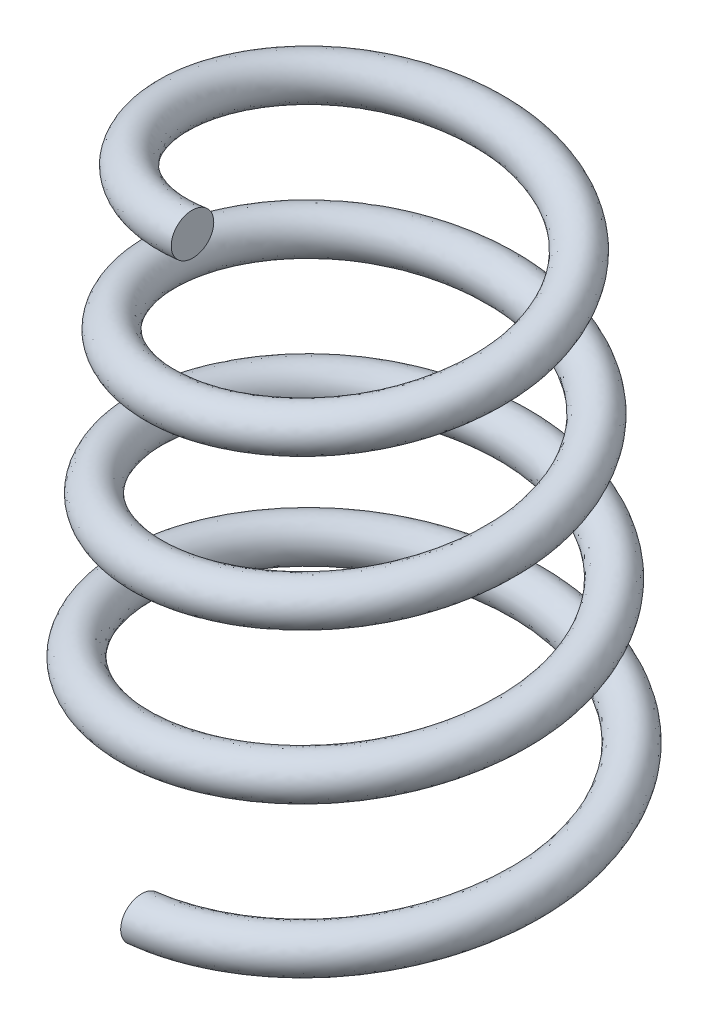
ISO-10303-21;
HEADER;
FILE_DESCRIPTION(('STEP AP214'),'2;1');
FILE_NAME('part.step','',(''),(''),'','','');
FILE_SCHEMA(('AUTOMOTIVE_DESIGN { 1 0 10303 214 1 1 1 1 }'));
ENDSEC;
DATA;
#1=APPLICATION_CONTEXT('core data for automotive mechanical design processes');
#2=APPLICATION_PROTOCOL_DEFINITION('international standard','automotive_design',2000,#1);
#3=PRODUCT_CONTEXT('',#1,'mechanical');
#4=PRODUCT('Part','Part','',(#3));
#5=PRODUCT_RELATED_PRODUCT_CATEGORY('part','',(#4));
#6=PRODUCT_DEFINITION_FORMATION('','',#4);
#7=PRODUCT_DEFINITION_CONTEXT('part definition',#1,'design');
#8=PRODUCT_DEFINITION('design','',#6,#7);
#9=PRODUCT_DEFINITION_SHAPE('','',#8);
#10=(LENGTH_UNIT() NAMED_UNIT(*) SI_UNIT(.MILLI.,.METRE.));
#11=(NAMED_UNIT(*) PLANE_ANGLE_UNIT() SI_UNIT($,.RADIAN.));
#12=(NAMED_UNIT(*) SI_UNIT($,.STERADIAN.) SOLID_ANGLE_UNIT());
#13=UNCERTAINTY_MEASURE_WITH_UNIT(LENGTH_MEASURE(1.E-05),#10,'distance_accuracy_value','');
#14=(GEOMETRIC_REPRESENTATION_CONTEXT(3) GLOBAL_UNCERTAINTY_ASSIGNED_CONTEXT((#13)) GLOBAL_UNIT_ASSIGNED_CONTEXT((#10,
#11,#12)) REPRESENTATION_CONTEXT('',''));
#15=CARTESIAN_POINT('',(0.,0.,0.));
#16=DIRECTION('',(0.,0.,1.));
#17=DIRECTION('',(1.,0.,0.));
#18=AXIS2_PLACEMENT_3D('',#15,#16,#17);
#19=CARTESIAN_POINT('',(-0.0596200976163737,-4.75659723193566,3.41562803727177));
#20=DIRECTION('',(0.999847694707909,0.,0.0174524321307998));
#21=DIRECTION('',(0.0174524321307998,0.,-0.999847694707909));
#22=AXIS2_PLACEMENT_3D('',#19,#20,#21);
#23=PLANE('',#22);
#24=CARTESIAN_POINT('',(-0.0596200976163737,-4.75659723193566,3.41562803727177));
#25=DIRECTION('',(0.999847694707909,0.,0.0174524321307998));
#26=DIRECTION('',(0.0174524321307998,0.,-0.999847694707909));
#27=AXIS2_PLACEMENT_3D('',#24,#25,#26);
#28=CIRCLE('',#27,0.35);
#29=CARTESIAN_POINT('',(-0.0535117463705938,-4.75659723193566,3.065681344124));
#30=VERTEX_POINT('',#29);
#31=EDGE_CURVE('E39',#30,#30,#28,.T.);
#32=ORIENTED_EDGE('',*,*,#31,.F.);
#33=EDGE_LOOP('',(#32));
#34=FACE_BOUND('',#33,.T.);
#35=ADVANCED_FACE('F32',(#34),#23,.F.);
#36=CARTESIAN_POINT('',(-0.0451146416645384,4.74340276806434,2.58461232116964));
#37=DIRECTION('',(0.99984769470791,0.,0.0174524321307422));
#38=DIRECTION('',(0.0174524321307422,0.,-0.99984769470791));
#39=AXIS2_PLACEMENT_3D('',#36,#37,#38);
#40=PLANE('',#39);
#41=CARTESIAN_POINT('',(-0.0451146416645384,4.74340276806434,2.58461232116964));
#42=DIRECTION('',(0.99984769470791,0.,0.0174524321307422));
#43=DIRECTION('',(0.0174524321307422,0.,-0.99984769470791));
#44=AXIS2_PLACEMENT_3D('',#41,#42,#43);
#45=CIRCLE('',#44,0.35);
#46=CARTESIAN_POINT('',(-0.0390062904187786,4.74340276806434,2.23466562802187));
#47=VERTEX_POINT('',#46);
#48=EDGE_CURVE('E11',#47,#47,#45,.T.);
#49=ORIENTED_EDGE('',*,*,#48,.T.);
#50=EDGE_LOOP('',(#49));
#51=FACE_BOUND('',#50,.T.);
#52=ADVANCED_FACE('F46',(#51),#40,.T.);
#53=CARTESIAN_POINT('',(-0.0535117463705938,-4.75659723193566,3.065681344124));
#54=CARTESIAN_POINT('',(0.750347781971695,-4.65750145627003,3.07104170741132));
#55=CARTESIAN_POINT('',(1.54755342235906,-4.55840568060533,2.74509411690741));
#56=CARTESIAN_POINT('',(2.6809311141912,-4.36021412927403,1.62408207934311));
#57=CARTESIAN_POINT('',(3.01037997350508,-4.26111835360862,0.836262511024693));
#58=CARTESIAN_POINT('',(3.01717666036292,-4.06292680227878,-0.744204597076181));
#59=CARTESIAN_POINT('',(2.69490544568697,-3.9638310266129,-1.52706006112067));
#60=CARTESIAN_POINT('',(1.5904341116593,-3.76563947528255,-2.6384317338444));
#61=CARTESIAN_POINT('',(0.815375814815229,-3.66654369961718,-2.96036167454748));
#62=CARTESIAN_POINT('',(-0.737830023036409,-3.46835214828631,-2.96335328356094));
#63=CARTESIAN_POINT('',(-1.50635520220292,-3.36925637262081,-2.64481948217569));
#64=CARTESIAN_POINT('',(-2.59579851587417,-3.17106482129073,-1.55697944500539));
#65=CARTESIAN_POINT('',(-2.91026681524683,-3.07196904562511,-0.794711413227318));
#66=CARTESIAN_POINT('',(-2.90957233023542,-2.87377749429446,0.731224203878779));
#67=CARTESIAN_POINT('',(-2.59483691006074,-2.77468171862911,1.4854391966849));
#68=CARTESIAN_POINT('',(-1.52371850271708,-2.57649016729851,2.55303210173393));
#69=CARTESIAN_POINT('',(-0.774269540363933,-2.47739439163281,2.86009612760226));
#70=CARTESIAN_POINT('',(0.724387294908949,-2.27920284030285,2.85583455309092));
#71=CARTESIAN_POINT('',(1.46431239764876,-2.18010706463694,2.54495841195092));
#72=CARTESIAN_POINT('',(2.51013313405899,-1.98191551330676,1.49065170628493));
#73=CARTESIAN_POINT('',(2.80985034428995,-1.88281973764137,0.754050428199204));
#74=CARTESIAN_POINT('',(2.80214070433403,-1.68462818631038,-0.717319453623387));
#75=CARTESIAN_POINT('',(2.49518466946423,-1.58553241064529,-1.44297516012349));
#76=CARTESIAN_POINT('',(1.45777947525812,-1.3873408593145,-2.46710225671483));
#77=CARTESIAN_POINT('',(0.73405430656252,-1.2882450836491,-2.75953019864338));
#78=CARTESIAN_POINT('',(-0.71002083969374,-1.09005353231873,-2.74849153568115));
#79=CARTESIAN_POINT('',(-1.4214278411404,-0.990957756653374,-2.44551636311084));
#80=CARTESIAN_POINT('',(-2.42394011473337,-0.792766205322497,-1.42510222735286));
#81=CARTESIAN_POINT('',(-2.70913642464514,-0.693670429657447,-0.714281403138023));
#82=CARTESIAN_POINT('',(-2.69488779835506,-0.495478878326467,0.702491614966737));
#83=CARTESIAN_POINT('',(-2.39595417234135,-0.3963831026612,1.39967079963997));
#84=CARTESIAN_POINT('',(-1.39262037839568,-0.198191551330758,2.38064735439829));
#85=CARTESIAN_POINT('',(-0.694731943475053,-0.0990957756657933,2.6586697568723));
#86=CARTESIAN_POINT('',(0.692804806262994,0.0988208910018053,2.64135429241929));
#87=CARTESIAN_POINT('',(1.37395325822134,0.197641782002138,2.348198404388));
#88=CARTESIAN_POINT('',(2.33298178089921,0.395283564005911,1.36683275894877));
#89=CARTESIAN_POINT('',(2.60528337843775,0.494104455006602,0.684928502865882));
#90=CARTESIAN_POINT('',(2.59095576318339,0.69174623700948,-0.67359203313435));
#91=CARTESIAN_POINT('',(2.30483165130455,0.790567128010226,-1.34188757303408));
#92=CARTESIAN_POINT('',(1.34467701033049,0.988208910013908,-2.28381290267626));
#93=CARTESIAN_POINT('',(0.67682272482872,1.08702980101448,-2.55196831717426));
#94=CARTESIAN_POINT('',(-0.65460252674914,1.28467158301769,-2.54048622135447));
#95=CARTESIAN_POINT('',(-1.31001777889513,1.38349247401838,-2.26133638244993));
#96=CARTESIAN_POINT('',(-2.23475202122431,1.58113425602184,-1.32231335719128));
#97=CARTESIAN_POINT('',(-2.49870127095248,1.67995514702336,-0.668487641448264));
#98=CARTESIAN_POINT('',(-2.48994640135878,1.8775969290249,0.635836504975012));
#99=CARTESIAN_POINT('',(-2.21771324644204,1.97641782002636,1.27834428347292));
#100=CARTESIAN_POINT('',(-1.2997421657686,2.17405960202994,2.18579980937242));
#101=CARTESIAN_POINT('',(-0.659923424181321,2.27288049303109,2.44548298639224));
#102=CARTESIAN_POINT('',(0.617294183529817,2.47052227503324,2.43933703826143));
#103=CARTESIAN_POINT('',(1.24686749251559,2.56934316603444,2.17396289303993));
#104=CARTESIAN_POINT('',(2.13695693888654,2.76698494803795,1.27696380427028));
#105=CARTESIAN_POINT('',(2.39231420960297,2.86580583903866,0.651130246664219));
#106=CARTESIAN_POINT('',(2.38865886772282,3.06344762104176,-0.598975776001237));
#107=CARTESIAN_POINT('',(2.13008597318445,3.16226851204439,-1.21558780987042));
#108=CARTESIAN_POINT('',(1.25397864282596,3.35991029404409,-2.08822408044168));
#109=CARTESIAN_POINT('',(0.642108284685686,3.45873118504759,-2.33919568616781));
#110=CARTESIAN_POINT('',(-0.580881493818942,3.65637296704892,-2.33791262600266));
#111=CARTESIAN_POINT('',(-1.1845056374974,3.75519385805084,-2.08608313896377));
#112=CARTESIAN_POINT('',(-2.0396019035999,3.95283564005372,-1.23078705351312));
#113=CARTESIAN_POINT('',(-2.28612816113168,4.05165653105386,-0.632857716202063));
#114=CARTESIAN_POINT('',(-2.2870990499602,4.24929831305873,0.563011546270275));
#115=CARTESIAN_POINT('',(-2.0419550436029,4.3481192040594,1.15362137542511));
#116=CARTESIAN_POINT('',(-1.20738941035937,4.54576098606125,1.99109107684599));
#117=CARTESIAN_POINT('',(-0.623378728914578,4.64458187706277,2.23311237920852));
#118=CARTESIAN_POINT('',(-0.0390062904187786,4.74340276806434,2.23466562802187));
#119=CARTESIAN_POINT('',(-0.0535117463705938,-4.05659723193566,3.065681344124));
#120=CARTESIAN_POINT('',(0.750347781971695,-3.95750145627003,3.07104170741132));
#121=CARTESIAN_POINT('',(1.54755342235906,-3.85840568060533,2.74509411690741));
#122=CARTESIAN_POINT('',(2.6809311141912,-3.66021412927403,1.62408207934311));
#123=CARTESIAN_POINT('',(3.01037997350508,-3.56111835360862,0.836262511024693));
#124=CARTESIAN_POINT('',(3.01717666036292,-3.36292680227879,-0.744204597076181));
#125=CARTESIAN_POINT('',(2.69490544568697,-3.26383102661271,-1.52706006112067));
#126=CARTESIAN_POINT('',(1.5904341116593,-3.06563947528274,-2.6384317338444));
#127=CARTESIAN_POINT('',(0.815375814815229,-2.96654369961719,-2.96036167454748));
#128=CARTESIAN_POINT('',(-0.737830023036409,-2.76835214828631,-2.96335328356094));
#129=CARTESIAN_POINT('',(-1.50635520220292,-2.66925637262081,-2.64481948217569));
#130=CARTESIAN_POINT('',(-2.59579851587417,-2.47106482129073,-1.5569794450054));
#131=CARTESIAN_POINT('',(-2.91026681524683,-2.37196904562511,-0.794711413227318));
#132=CARTESIAN_POINT('',(-2.90957233023542,-2.17377749429446,0.731224203878779));
#133=CARTESIAN_POINT('',(-2.59483691006074,-2.07468171862929,1.4854391966849));
#134=CARTESIAN_POINT('',(-1.52371850271709,-1.87649016729832,2.55303210173393));
#135=CARTESIAN_POINT('',(-0.774269540363933,-1.77739439163281,2.86009612760226));
#136=CARTESIAN_POINT('',(0.724387294908949,-1.57920284030285,2.85583455309092));
#137=CARTESIAN_POINT('',(1.46431239764876,-1.48010706463694,2.54495841195092));
#138=CARTESIAN_POINT('',(2.51013313405899,-1.28191551330676,1.49065170628493));
#139=CARTESIAN_POINT('',(2.80985034428995,-1.18281973764118,0.754050428199204));
#140=CARTESIAN_POINT('',(2.80214070433403,-0.984628186310562,-0.717319453623387));
#141=CARTESIAN_POINT('',(2.49518466946423,-0.885532410645291,-1.44297516012349));
#142=CARTESIAN_POINT('',(1.45777947525812,-0.687340859314497,-2.46710225671483));
#143=CARTESIAN_POINT('',(0.73405430656252,-0.588245083649101,-2.75953019864338));
#144=CARTESIAN_POINT('',(-0.71002083969374,-0.390053532318725,-2.74849153568115));
#145=CARTESIAN_POINT('',(-1.4214278411404,-0.290957756653283,-2.44551636311084));
#146=CARTESIAN_POINT('',(-2.42394011473337,-0.0927662053225897,-1.42510222735286));
#147=CARTESIAN_POINT('',(-2.70913642464514,0.00632957034255236,-0.714281403138023));
#148=CARTESIAN_POINT('',(-2.69488779835506,0.204521121673533,0.702491614966737));
#149=CARTESIAN_POINT('',(-2.39595417234135,0.3036168973388,1.39967079963997));
#150=CARTESIAN_POINT('',(-1.39262037839568,0.501808448669242,2.38064735439829));
#151=CARTESIAN_POINT('',(-0.694731943475053,0.600904224334206,2.6586697568723));
#152=CARTESIAN_POINT('',(0.692804806262994,0.798820891001805,2.64135429241929));
#153=CARTESIAN_POINT('',(1.37395325822134,0.897641782002138,2.348198404388));
#154=CARTESIAN_POINT('',(2.33298178089921,1.09528356400591,1.36683275894877));
#155=CARTESIAN_POINT('',(2.60528337843775,1.1941044550066,0.684928502865882));
#156=CARTESIAN_POINT('',(2.59095576318339,1.39174623700948,-0.67359203313435));
#157=CARTESIAN_POINT('',(2.30483165130455,1.49056712801014,-1.34188757303408));
#158=CARTESIAN_POINT('',(1.34467701033049,1.688208910014,-2.28381290267626));
#159=CARTESIAN_POINT('',(0.67682272482872,1.78702980101448,-2.55196831717426));
#160=CARTESIAN_POINT('',(-0.654602526749141,1.98467158301769,-2.54048622135447));
#161=CARTESIAN_POINT('',(-1.31001777889513,2.08349247401838,-2.26133638244993));
#162=CARTESIAN_POINT('',(-2.23475202122431,2.28113425602184,-1.32231335719128));
#163=CARTESIAN_POINT('',(-2.49870127095248,2.37995514702344,-0.668487641448264));
#164=CARTESIAN_POINT('',(-2.48994640135878,2.57759692902481,0.635836504975013));
#165=CARTESIAN_POINT('',(-2.21771324644204,2.67641782002636,1.27834428347292));
#166=CARTESIAN_POINT('',(-1.2997421657686,2.87405960202994,2.18579980937242));
#167=CARTESIAN_POINT('',(-0.659923424181321,2.97288049303109,2.44548298639224));
#168=CARTESIAN_POINT('',(0.617294183529817,3.17052227503324,2.43933703826143));
#169=CARTESIAN_POINT('',(1.24686749251559,3.26934316603444,2.17396289303993));
#170=CARTESIAN_POINT('',(2.13695693888654,3.46698494803795,1.27696380427028));
#171=CARTESIAN_POINT('',(2.39231420960297,3.56580583903866,0.651130246664219));
#172=CARTESIAN_POINT('',(2.38865886772282,3.76344762104176,-0.598975776001237));
#173=CARTESIAN_POINT('',(2.13008597318445,3.86226851204439,-1.21558780987042));
#174=CARTESIAN_POINT('',(1.25397864282596,4.05991029404409,-2.08822408044168));
#175=CARTESIAN_POINT('',(0.642108284685686,4.15873118504794,-2.33919568616781));
#176=CARTESIAN_POINT('',(-0.580881493818942,4.35637296704857,-2.33791262600266));
#177=CARTESIAN_POINT('',(-1.1845056374974,4.45519385805084,-2.08608313896377));
#178=CARTESIAN_POINT('',(-2.0396019035999,4.65283564005372,-1.23078705351312));
#179=CARTESIAN_POINT('',(-2.28612816113168,4.75165653105369,-0.632857716202063));
#180=CARTESIAN_POINT('',(-2.2870990499602,4.9492983130589,0.563011546270275));
#181=CARTESIAN_POINT('',(-2.0419550436029,5.0481192040594,1.15362137542511));
#182=CARTESIAN_POINT('',(-1.20738941035937,5.24576098606125,1.99109107684599));
#183=CARTESIAN_POINT('',(-0.623378728914578,5.34458187706277,2.23311237920852));
#184=CARTESIAN_POINT('',(-0.0390062904187786,5.44340276806434,2.23466562802187));
#185=CARTESIAN_POINT('',(-0.0657284488621536,-4.05659723193566,3.76557473041953));
#186=CARTESIAN_POINT('',(0.921617229713494,-3.95750145627003,3.77413786109047));
#187=CARTESIAN_POINT('',(1.90249339401658,-3.85840568060533,3.37572478600163));
#188=CARTESIAN_POINT('',(3.2996108073109,-3.66021412927403,1.99946569859627));
#189=CARTESIAN_POINT('',(3.70749589212703,-3.56111835360862,1.03044495174826));
#190=CARTESIAN_POINT('',(3.71989748853473,-3.36292680227879,-0.917007554038717));
#191=CARTESIAN_POINT('',(3.32476025456344,-3.26383102661271,-1.88337501171302));
#192=CARTESIAN_POINT('',(1.96446708694357,-3.06563947528274,-3.25792891517748));
#193=CARTESIAN_POINT('',(1.00803692137169,-2.96654369961719,-3.65789957480761));
#194=CARTESIAN_POINT('',(-0.912165668812998,-2.76835214828631,-3.66569544155124));
#195=CARTESIAN_POINT('',(-1.86404343579266,-2.66925637262081,-3.27389543293907));
#196=CARTESIAN_POINT('',(-3.21611023682474,-2.47106482129073,-1.92965999605229));
#197=CARTESIAN_POINT('',(-3.60822337710194,-2.37196904562511,-0.985850268615983));
#198=CARTESIAN_POINT('',(-3.61153247513525,-2.17377749429446,0.907091708691676));
#199=CARTESIAN_POINT('',(-3.22313100852519,-2.07468171862929,1.84449901079594));
#200=CARTESIAN_POINT('',(-1.89504485569276,-1.87649016729832,3.17415540983151));
#201=CARTESIAN_POINT('',(-0.963885234828928,-1.77739439163281,3.55846802901743));
#202=CARTESIAN_POINT('',(0.901785821688705,-1.57920284030285,3.5574093438086));
#203=CARTESIAN_POINT('',(1.8247420832823,-1.48010706463694,3.17246766764963));
#204=CARTESIAN_POINT('',(3.13206507296465,-1.28191551330676,1.86062209380342));
#205=CARTESIAN_POINT('',(3.50863426125297,-1.18281973764118,0.942142059235517));
#206=CARTESIAN_POINT('',(3.50332680161249,-0.984628186310562,-0.896248158014549));
#207=CARTESIAN_POINT('',(3.12190609566791,-0.885532410645291,-1.80477300175307));
#208=CARTESIAN_POINT('',(1.82639213638543,-0.687340859314497,-3.08983986624836));
#209=CARTESIAN_POINT('',(0.920620978918682,-0.588245083649101,-3.45872280518031));
#210=CARTESIAN_POINT('',(-0.890478870057249,-0.390053532318725,-3.44928560211401));
#211=CARTESIAN_POINT('',(-1.78459211673356,-0.290957756653283,-3.07144697683841));
#212=CARTESIAN_POINT('',(-3.04748043087393,-0.0927662053225898,-1.79235540761892));
#213=CARTESIAN_POINT('',(-3.40873439283758,0.00632957034255237,-0.899322228818943));
#214=CARTESIAN_POINT('',(-3.3952864984011,0.204521121673533,0.88447811238255));
#215=CARTESIAN_POINT('',(-3.02109099437652,0.3036168973388,1.76419978065789));
#216=CARTESIAN_POINT('',(-1.7585123298003,0.501808448669242,3.00498740930698));
#217=CARTESIAN_POINT('',(-0.878246041747875,0.600904224334206,3.3586697568723));
#218=CARTESIAN_POINT('',(0.875809849423206,0.798820891001805,3.34135429241929));
#219=CARTESIAN_POINT('',(1.7388425880029,0.897641782002138,2.97297566296321));
#220=CARTESIAN_POINT('',(2.95696148704428,1.09528356400591,1.73308427381333));
#221=CARTESIAN_POINT('',(3.304882457217,1.1941044550066,0.869460274631833));
#222=CARTESIAN_POINT('',(3.29135335264261,1.39174623700948,-0.855069476635195));
#223=CARTESIAN_POINT('',(2.93040348857853,1.49056712801014,-1.70541298098893));
#224=CARTESIAN_POINT('',(1.71228896705013,1.688208910014,-2.90699208645513));
#225=CARTESIAN_POINT('',(0.862880346891881,1.78702980101448,-3.25116314487952));
#226=CARTESIAN_POINT('',(-0.834551506819655,1.98467158301769,-3.241278066619));
#227=CARTESIAN_POINT('',(-1.67217753476482,2.08349247401838,-2.88769982091435));
#228=CARTESIAN_POINT('',(-2.85712771651777,2.28113425602184,-1.69128400605783));
#229=CARTESIAN_POINT('',(-3.19748851965466,2.37995514702344,-0.856070228238078));
#230=CARTESIAN_POINT('',(-3.19112916689808,2.57759692902481,0.8142561651197));
#231=CARTESIAN_POINT('',(-2.84486530481981,2.67641782002636,1.639136663501));
#232=CARTESIAN_POINT('',(-1.67006975060799,2.87405960202994,2.80736905388357));
#233=CARTESIAN_POINT('',(-0.849030082867357,2.97288049303109,3.14385933010184));
#234=CARTESIAN_POINT('',(0.794183674530638,3.17052227503324,3.1409073866847));
#235=CARTESIAN_POINT('',(1.6062907794547,3.26934316603444,2.801900586301));
#236=CARTESIAN_POINT('',(2.75771677415609,3.46698494803795,1.64864656244931));
#237=CARTESIAN_POINT('',(3.09027632428703,3.56580583903866,0.841760077164186));
#238=CARTESIAN_POINT('',(3.09061345979369,3.76344762104176,-0.774334255925483));
#239=CARTESIAN_POINT('',(2.75880631255953,3.86226851204439,-1.57364029298643));
#240=CARTESIAN_POINT('',(1.6270148052611,4.05991029404409,-2.70817155186603));
#241=CARTESIAN_POINT('',(0.834260379666298,4.15873118504794,-3.03674024976495));
#242=CARTESIAN_POINT('',(-0.754708128019734,4.35637296704857,-3.04024812065594));
#243=CARTESIAN_POINT('',(-1.54118561258271,4.45519385805084,-2.71558313195868));
#244=CARTESIAN_POINT('',(-2.65873406044006,4.65283564005372,-1.60517484467889));
#245=CARTESIAN_POINT('',(-2.98325185356627,4.75165653105369,-0.826531161084619));
#246=CARTESIAN_POINT('',(-2.98981210431936,4.9492983130589,0.735305507391872));
#247=CARTESIAN_POINT('',(-2.67223169401149,5.0481192040594,1.50892714480567));
#248=CARTESIAN_POINT('',(-1.5831270482981,5.24576098606125,2.60940497224271));
#249=CARTESIAN_POINT('',(-0.818572604252497,5.34458187706277,2.9298118823684));
#250=CARTESIAN_POINT('',(-0.0512229929102981,5.44340276806434,2.93455901431741));
#251=CARTESIAN_POINT('',(-0.0657284488621536,-4.75659723193566,3.76557473041953));
#252=CARTESIAN_POINT('',(0.921617229713494,-4.65750145627003,3.77413786109047));
#253=CARTESIAN_POINT('',(1.90249339401658,-4.55840568060533,3.37572478600163));
#254=CARTESIAN_POINT('',(3.2996108073109,-4.36021412927403,1.99946569859627));
#255=CARTESIAN_POINT('',(3.70749589212703,-4.26111835360862,1.03044495174826));
#256=CARTESIAN_POINT('',(3.71989748853473,-4.06292680227878,-0.917007554038716));
#257=CARTESIAN_POINT('',(3.32476025456344,-3.9638310266129,-1.88337501171302));
#258=CARTESIAN_POINT('',(1.96446708694357,-3.76563947528255,-3.25792891517748));
#259=CARTESIAN_POINT('',(1.00803692137169,-3.66654369961718,-3.65789957480761));
#260=CARTESIAN_POINT('',(-0.912165668812998,-3.46835214828631,-3.66569544155124));
#261=CARTESIAN_POINT('',(-1.86404343579266,-3.36925637262081,-3.27389543293906));
#262=CARTESIAN_POINT('',(-3.21611023682474,-3.17106482129073,-1.92965999605229));
#263=CARTESIAN_POINT('',(-3.60822337710194,-3.07196904562511,-0.985850268615983));
#264=CARTESIAN_POINT('',(-3.61153247513525,-2.87377749429446,0.907091708691676));
#265=CARTESIAN_POINT('',(-3.22313100852519,-2.77468171862911,1.84449901079594));
#266=CARTESIAN_POINT('',(-1.89504485569276,-2.57649016729851,3.17415540983151));
#267=CARTESIAN_POINT('',(-0.963885234828928,-2.47739439163281,3.55846802901743));
#268=CARTESIAN_POINT('',(0.901785821688705,-2.27920284030285,3.5574093438086));
#269=CARTESIAN_POINT('',(1.8247420832823,-2.18010706463694,3.17246766764963));
#270=CARTESIAN_POINT('',(3.13206507296465,-1.98191551330676,1.86062209380342));
#271=CARTESIAN_POINT('',(3.50863426125297,-1.88281973764137,0.942142059235517));
#272=CARTESIAN_POINT('',(3.50332680161249,-1.68462818631038,-0.896248158014549));
#273=CARTESIAN_POINT('',(3.12190609566791,-1.58553241064529,-1.80477300175307));
#274=CARTESIAN_POINT('',(1.82639213638543,-1.3873408593145,-3.08983986624836));
#275=CARTESIAN_POINT('',(0.920620978918682,-1.2882450836491,-3.45872280518031));
#276=CARTESIAN_POINT('',(-0.890478870057249,-1.09005353231872,-3.449285602114));
#277=CARTESIAN_POINT('',(-1.78459211673356,-0.990957756653374,-3.07144697683841));
#278=CARTESIAN_POINT('',(-3.04748043087393,-0.792766205322498,-1.79235540761892));
#279=CARTESIAN_POINT('',(-3.40873439283758,-0.693670429657447,-0.899322228818943));
#280=CARTESIAN_POINT('',(-3.3952864984011,-0.495478878326467,0.88447811238255));
#281=CARTESIAN_POINT('',(-3.02109099437652,-0.3963831026612,1.76419978065789));
#282=CARTESIAN_POINT('',(-1.7585123298003,-0.198191551330758,3.00498740930698));
#283=CARTESIAN_POINT('',(-0.878246041747875,-0.0990957756657933,3.3586697568723));
#284=CARTESIAN_POINT('',(0.875809849423206,0.0988208910018053,3.34135429241929));
#285=CARTESIAN_POINT('',(1.7388425880029,0.197641782002139,2.97297566296321));
#286=CARTESIAN_POINT('',(2.95696148704428,0.395283564005911,1.73308427381333));
#287=CARTESIAN_POINT('',(3.304882457217,0.494104455006602,0.869460274631833));
#288=CARTESIAN_POINT('',(3.29135335264261,0.69174623700948,-0.855069476635195));
#289=CARTESIAN_POINT('',(2.93040348857853,0.790567128010226,-1.70541298098893));
#290=CARTESIAN_POINT('',(1.71228896705013,0.988208910013908,-2.90699208645513));
#291=CARTESIAN_POINT('',(0.862880346891881,1.08702980101448,-3.25116314487952));
#292=CARTESIAN_POINT('',(-0.834551506819655,1.28467158301769,-3.241278066619));
#293=CARTESIAN_POINT('',(-1.67217753476482,1.38349247401838,-2.88769982091435));
#294=CARTESIAN_POINT('',(-2.85712771651777,1.58113425602184,-1.69128400605783));
#295=CARTESIAN_POINT('',(-3.19748851965466,1.67995514702336,-0.856070228238078));
#296=CARTESIAN_POINT('',(-3.19112916689808,1.8775969290249,0.8142561651197));
#297=CARTESIAN_POINT('',(-2.84486530481981,1.97641782002636,1.639136663501));
#298=CARTESIAN_POINT('',(-1.67006975060799,2.17405960202994,2.80736905388357));
#299=CARTESIAN_POINT('',(-0.849030082867357,2.27288049303109,3.14385933010184));
#300=CARTESIAN_POINT('',(0.794183674530638,2.47052227503324,3.1409073866847));
#301=CARTESIAN_POINT('',(1.6062907794547,2.56934316603444,2.801900586301));
#302=CARTESIAN_POINT('',(2.75771677415609,2.76698494803795,1.64864656244931));
#303=CARTESIAN_POINT('',(3.09027632428703,2.86580583903866,0.841760077164186));
#304=CARTESIAN_POINT('',(3.09061345979369,3.06344762104176,-0.774334255925483));
#305=CARTESIAN_POINT('',(2.75880631255953,3.16226851204439,-1.57364029298643));
#306=CARTESIAN_POINT('',(1.6270148052611,3.35991029404409,-2.70817155186603));
#307=CARTESIAN_POINT('',(0.834260379666298,3.45873118504759,-3.03674024976495));
#308=CARTESIAN_POINT('',(-0.754708128019734,3.65637296704892,-3.04024812065594));
#309=CARTESIAN_POINT('',(-1.54118561258271,3.75519385805084,-2.71558313195868));
#310=CARTESIAN_POINT('',(-2.65873406044006,3.95283564005372,-1.60517484467889));
#311=CARTESIAN_POINT('',(-2.98325185356627,4.05165653105386,-0.826531161084619));
#312=CARTESIAN_POINT('',(-2.98981210431936,4.24929831305873,0.735305507391872));
#313=CARTESIAN_POINT('',(-2.67223169401149,4.3481192040594,1.50892714480567));
#314=CARTESIAN_POINT('',(-1.5831270482981,4.54576098606125,2.60940497224271));
#315=CARTESIAN_POINT('',(-0.818572604252497,4.64458187706277,2.9298118823684));
#316=CARTESIAN_POINT('',(-0.0512229929102981,4.74340276806434,2.93455901431741));
#317=CARTESIAN_POINT('',(-0.0657284488621536,-5.45659723193566,3.76557473041953));
#318=CARTESIAN_POINT('',(0.921617229713494,-5.35750145627003,3.77413786109047));
#319=CARTESIAN_POINT('',(1.90249339401658,-5.25840568060533,3.37572478600163));
#320=CARTESIAN_POINT('',(3.2996108073109,-5.06021412927403,1.99946569859627));
#321=CARTESIAN_POINT('',(3.70749589212703,-4.96111835360862,1.03044495174826));
#322=CARTESIAN_POINT('',(3.71989748853473,-4.76292680227878,-0.917007554038717));
#323=CARTESIAN_POINT('',(3.32476025456344,-4.66383102661308,-1.88337501171302));
#324=CARTESIAN_POINT('',(1.96446708694357,-4.46563947528236,-3.25792891517748));
#325=CARTESIAN_POINT('',(1.00803692137169,-4.36654369961718,-3.65789957480761));
#326=CARTESIAN_POINT('',(-0.912165668812998,-4.1683521482863,-3.66569544155124));
#327=CARTESIAN_POINT('',(-1.86404343579266,-4.06925637262081,-3.27389543293907));
#328=CARTESIAN_POINT('',(-3.21611023682474,-3.87106482129073,-1.92965999605229));
#329=CARTESIAN_POINT('',(-3.60822337710194,-3.77196904562511,-0.985850268615983));
#330=CARTESIAN_POINT('',(-3.61153247513525,-3.57377749429446,0.907091708691676));
#331=CARTESIAN_POINT('',(-3.22313100852519,-3.47468171862892,1.84449901079594));
#332=CARTESIAN_POINT('',(-1.89504485569276,-3.27649016729869,3.17415540983151));
#333=CARTESIAN_POINT('',(-0.963885234828928,-3.17739439163281,3.55846802901743));
#334=CARTESIAN_POINT('',(0.901785821688705,-2.97920284030285,3.5574093438086));
#335=CARTESIAN_POINT('',(1.8247420832823,-2.88010706463694,3.17246766764963));
#336=CARTESIAN_POINT('',(3.13206507296465,-2.68191551330676,1.86062209380342));
#337=CARTESIAN_POINT('',(3.50863426125297,-2.58281973764155,0.942142059235517));
#338=CARTESIAN_POINT('',(3.50332680161249,-2.38462818631019,-0.896248158014549));
#339=CARTESIAN_POINT('',(3.12190609566791,-2.28553241064529,-1.80477300175307));
#340=CARTESIAN_POINT('',(1.82639213638543,-2.0873408593145,-3.08983986624836));
#341=CARTESIAN_POINT('',(0.920620978918682,-1.9882450836491,-3.45872280518031));
#342=CARTESIAN_POINT('',(-0.890478870057249,-1.79005353231872,-3.44928560211401));
#343=CARTESIAN_POINT('',(-1.78459211673356,-1.69095775665347,-3.07144697683841));
#344=CARTESIAN_POINT('',(-3.04748043087393,-1.49276620532241,-1.79235540761892));
#345=CARTESIAN_POINT('',(-3.40873439283758,-1.39367042965745,-0.899322228818943));
#346=CARTESIAN_POINT('',(-3.3952864984011,-1.19547887832647,0.88447811238255));
#347=CARTESIAN_POINT('',(-3.02109099437652,-1.0963831026612,1.76419978065789));
#348=CARTESIAN_POINT('',(-1.7585123298003,-0.898191551330757,3.00498740930698));
#349=CARTESIAN_POINT('',(-0.878246041747875,-0.799095775665793,3.3586697568723));
#350=CARTESIAN_POINT('',(0.875809849423206,-0.601179108998194,3.34135429241929));
#351=CARTESIAN_POINT('',(1.7388425880029,-0.502358217997861,2.97297566296321));
#352=CARTESIAN_POINT('',(2.95696148704428,-0.304716435994089,1.73308427381333));
#353=CARTESIAN_POINT('',(3.304882457217,-0.205895544993398,0.869460274631833));
#354=CARTESIAN_POINT('',(3.29135335264261,-0.00825376299051975,-0.855069476635195));
#355=CARTESIAN_POINT('',(2.93040348857853,0.0905671280103166,-1.70541298098893));
#356=CARTESIAN_POINT('',(1.71228896705013,0.288208910013818,-2.90699208645513));
#357=CARTESIAN_POINT('',(0.862880346891881,0.387029801014477,-3.25116314487952));
#358=CARTESIAN_POINT('',(-0.834551506819655,0.584671583017689,-3.241278066619));
#359=CARTESIAN_POINT('',(-1.67217753476482,0.683492474018385,-2.88769982091435));
#360=CARTESIAN_POINT('',(-2.85712771651777,0.881134256021837,-1.69128400605783));
#361=CARTESIAN_POINT('',(-3.19748851965466,0.979955147023266,-0.856070228238079));
#362=CARTESIAN_POINT('',(-3.19112916689808,1.17759692902499,0.8142561651197));
#363=CARTESIAN_POINT('',(-2.84486530481981,1.27641782002636,1.639136663501));
#364=CARTESIAN_POINT('',(-1.67006975060799,1.47405960202994,2.80736905388357));
#365=CARTESIAN_POINT('',(-0.849030082867357,1.57288049303109,3.14385933010184));
#366=CARTESIAN_POINT('',(0.794183674530638,1.77052227503324,3.1409073866847));
#367=CARTESIAN_POINT('',(1.6062907794547,1.86934316603444,2.801900586301));
#368=CARTESIAN_POINT('',(2.75771677415609,2.06698494803795,1.64864656244931));
#369=CARTESIAN_POINT('',(3.09027632428703,2.16580583903866,0.841760077164186));
#370=CARTESIAN_POINT('',(3.09061345979369,2.36344762104176,-0.774334255925483));
#371=CARTESIAN_POINT('',(2.75880631255953,2.46226851204439,-1.57364029298643));
#372=CARTESIAN_POINT('',(1.6270148052611,2.65991029404409,-2.70817155186603));
#373=CARTESIAN_POINT('',(0.834260379666298,2.75873118504723,-3.03674024976495));
#374=CARTESIAN_POINT('',(-0.754708128019734,2.95637296704928,-3.04024812065594));
#375=CARTESIAN_POINT('',(-1.54118561258271,3.05519385805084,-2.71558313195868));
#376=CARTESIAN_POINT('',(-2.65873406044006,3.25283564005372,-1.60517484467889));
#377=CARTESIAN_POINT('',(-2.98325185356627,3.35165653105404,-0.826531161084619));
#378=CARTESIAN_POINT('',(-2.98981210431936,3.54929831305855,0.735305507391872));
#379=CARTESIAN_POINT('',(-2.67223169401149,3.6481192040594,1.50892714480567));
#380=CARTESIAN_POINT('',(-1.5831270482981,3.84576098606125,2.60940497224271));
#381=CARTESIAN_POINT('',(-0.818572604252497,3.94458187706277,2.9298118823684));
#382=CARTESIAN_POINT('',(-0.0512229929102981,4.04340276806434,2.93455901431741));
#383=CARTESIAN_POINT('',(-0.0535117463705938,-5.45659723193566,3.065681344124));
#384=CARTESIAN_POINT('',(0.750347781971695,-5.35750145627003,3.07104170741132));
#385=CARTESIAN_POINT('',(1.54755342235906,-5.25840568060533,2.74509411690741));
#386=CARTESIAN_POINT('',(2.6809311141912,-5.06021412927403,1.62408207934311));
#387=CARTESIAN_POINT('',(3.01037997350508,-4.96111835360862,0.836262511024693));
#388=CARTESIAN_POINT('',(3.01717666036292,-4.76292680227878,-0.744204597076181));
#389=CARTESIAN_POINT('',(2.69490544568697,-4.66383102661308,-1.52706006112067));
#390=CARTESIAN_POINT('',(1.5904341116593,-4.46563947528236,-2.6384317338444));
#391=CARTESIAN_POINT('',(0.815375814815229,-4.36654369961718,-2.96036167454748));
#392=CARTESIAN_POINT('',(-0.737830023036409,-4.1683521482863,-2.96335328356094));
#393=CARTESIAN_POINT('',(-1.50635520220292,-4.06925637262081,-2.64481948217569));
#394=CARTESIAN_POINT('',(-2.59579851587417,-3.87106482129073,-1.5569794450054));
#395=CARTESIAN_POINT('',(-2.91026681524683,-3.77196904562511,-0.794711413227318));
#396=CARTESIAN_POINT('',(-2.90957233023542,-3.57377749429446,0.731224203878779));
#397=CARTESIAN_POINT('',(-2.59483691006074,-3.47468171862892,1.4854391966849));
#398=CARTESIAN_POINT('',(-1.52371850271709,-3.27649016729869,2.55303210173393));
#399=CARTESIAN_POINT('',(-0.774269540363933,-3.17739439163281,2.86009612760226));
#400=CARTESIAN_POINT('',(0.724387294908949,-2.97920284030285,2.85583455309092));
#401=CARTESIAN_POINT('',(1.46431239764876,-2.88010706463694,2.54495841195092));
#402=CARTESIAN_POINT('',(2.51013313405899,-2.68191551330676,1.49065170628493));
#403=CARTESIAN_POINT('',(2.80985034428995,-2.58281973764155,0.754050428199204));
#404=CARTESIAN_POINT('',(2.80214070433403,-2.38462818631019,-0.717319453623387));
#405=CARTESIAN_POINT('',(2.49518466946423,-2.28553241064529,-1.44297516012349));
#406=CARTESIAN_POINT('',(1.45777947525812,-2.0873408593145,-2.46710225671483));
#407=CARTESIAN_POINT('',(0.73405430656252,-1.9882450836491,-2.75953019864338));
#408=CARTESIAN_POINT('',(-0.71002083969374,-1.79005353231872,-2.74849153568115));
#409=CARTESIAN_POINT('',(-1.4214278411404,-1.69095775665347,-2.44551636311084));
#410=CARTESIAN_POINT('',(-2.42394011473337,-1.49276620532241,-1.42510222735286));
#411=CARTESIAN_POINT('',(-2.70913642464514,-1.39367042965745,-0.714281403138023));
#412=CARTESIAN_POINT('',(-2.69488779835506,-1.19547887832647,0.702491614966737));
#413=CARTESIAN_POINT('',(-2.39595417234135,-1.0963831026612,1.39967079963997));
#414=CARTESIAN_POINT('',(-1.39262037839568,-0.898191551330757,2.38064735439829));
#415=CARTESIAN_POINT('',(-0.694731943475053,-0.799095775665793,2.6586697568723));
#416=CARTESIAN_POINT('',(0.692804806262994,-0.601179108998194,2.64135429241929));
#417=CARTESIAN_POINT('',(1.37395325822134,-0.502358217997861,2.348198404388));
#418=CARTESIAN_POINT('',(2.33298178089921,-0.304716435994089,1.36683275894877));
#419=CARTESIAN_POINT('',(2.60528337843775,-0.205895544993398,0.684928502865882));
#420=CARTESIAN_POINT('',(2.59095576318339,-0.00825376299051981,-0.67359203313435));
#421=CARTESIAN_POINT('',(2.30483165130455,0.0905671280103166,-1.34188757303408));
#422=CARTESIAN_POINT('',(1.34467701033049,0.288208910013818,-2.28381290267626));
#423=CARTESIAN_POINT('',(0.67682272482872,0.387029801014477,-2.55196831717426));
#424=CARTESIAN_POINT('',(-0.654602526749141,0.584671583017689,-2.54048622135447));
#425=CARTESIAN_POINT('',(-1.31001777889513,0.683492474018385,-2.26133638244993));
#426=CARTESIAN_POINT('',(-2.23475202122431,0.881134256021837,-1.32231335719128));
#427=CARTESIAN_POINT('',(-2.49870127095248,0.979955147023266,-0.668487641448264));
#428=CARTESIAN_POINT('',(-2.48994640135878,1.17759692902499,0.635836504975013));
#429=CARTESIAN_POINT('',(-2.21771324644204,1.27641782002636,1.27834428347292));
#430=CARTESIAN_POINT('',(-1.2997421657686,1.47405960202994,2.18579980937242));
#431=CARTESIAN_POINT('',(-0.659923424181321,1.57288049303109,2.44548298639224));
#432=CARTESIAN_POINT('',(0.617294183529817,1.77052227503324,2.43933703826143));
#433=CARTESIAN_POINT('',(1.24686749251559,1.86934316603444,2.17396289303993));
#434=CARTESIAN_POINT('',(2.13695693888654,2.06698494803795,1.27696380427028));
#435=CARTESIAN_POINT('',(2.39231420960297,2.16580583903866,0.651130246664219));
#436=CARTESIAN_POINT('',(2.38865886772282,2.36344762104176,-0.598975776001237));
#437=CARTESIAN_POINT('',(2.13008597318445,2.46226851204439,-1.21558780987042));
#438=CARTESIAN_POINT('',(1.25397864282596,2.65991029404409,-2.08822408044168));
#439=CARTESIAN_POINT('',(0.642108284685686,2.75873118504723,-2.33919568616781));
#440=CARTESIAN_POINT('',(-0.580881493818942,2.95637296704928,-2.33791262600266));
#441=CARTESIAN_POINT('',(-1.1845056374974,3.05519385805084,-2.08608313896377));
#442=CARTESIAN_POINT('',(-2.0396019035999,3.25283564005372,-1.23078705351312));
#443=CARTESIAN_POINT('',(-2.28612816113168,3.35165653105404,-0.632857716202063));
#444=CARTESIAN_POINT('',(-2.2870990499602,3.54929831305855,0.563011546270275));
#445=CARTESIAN_POINT('',(-2.0419550436029,3.6481192040594,1.15362137542511));
#446=CARTESIAN_POINT('',(-1.20738941035937,3.84576098606125,1.99109107684599));
#447=CARTESIAN_POINT('',(-0.623378728914578,3.94458187706277,2.23311237920852));
#448=CARTESIAN_POINT('',(-0.0390062904187786,4.04340276806434,2.23466562802187));
#449=CARTESIAN_POINT('',(-0.0535117463705938,-4.75659723193566,3.065681344124));
#450=CARTESIAN_POINT('',(0.750347781971695,-4.65750145627003,3.07104170741132));
#451=CARTESIAN_POINT('',(1.54755342235906,-4.55840568060533,2.74509411690741));
#452=CARTESIAN_POINT('',(2.6809311141912,-4.36021412927403,1.62408207934311));
#453=CARTESIAN_POINT('',(3.01037997350508,-4.26111835360862,0.836262511024693));
#454=CARTESIAN_POINT('',(3.01717666036292,-4.06292680227878,-0.744204597076181));
#455=CARTESIAN_POINT('',(2.69490544568697,-3.9638310266129,-1.52706006112067));
#456=CARTESIAN_POINT('',(1.5904341116593,-3.76563947528255,-2.6384317338444));
#457=CARTESIAN_POINT('',(0.815375814815229,-3.66654369961718,-2.96036167454748));
#458=CARTESIAN_POINT('',(-0.737830023036409,-3.46835214828631,-2.96335328356094));
#459=CARTESIAN_POINT('',(-1.50635520220292,-3.36925637262081,-2.64481948217569));
#460=CARTESIAN_POINT('',(-2.59579851587417,-3.17106482129073,-1.55697944500539));
#461=CARTESIAN_POINT('',(-2.91026681524683,-3.07196904562511,-0.794711413227318));
#462=CARTESIAN_POINT('',(-2.90957233023542,-2.87377749429446,0.731224203878779));
#463=CARTESIAN_POINT('',(-2.59483691006074,-2.77468171862911,1.4854391966849));
#464=CARTESIAN_POINT('',(-1.52371850271708,-2.57649016729851,2.55303210173393));
#465=CARTESIAN_POINT('',(-0.774269540363933,-2.47739439163281,2.86009612760226));
#466=CARTESIAN_POINT('',(0.724387294908949,-2.27920284030285,2.85583455309092));
#467=CARTESIAN_POINT('',(1.46431239764876,-2.18010706463694,2.54495841195092));
#468=CARTESIAN_POINT('',(2.51013313405899,-1.98191551330676,1.49065170628493));
#469=CARTESIAN_POINT('',(2.80985034428995,-1.88281973764137,0.754050428199204));
#470=CARTESIAN_POINT('',(2.80214070433403,-1.68462818631038,-0.717319453623387));
#471=CARTESIAN_POINT('',(2.49518466946423,-1.58553241064529,-1.44297516012349));
#472=CARTESIAN_POINT('',(1.45777947525812,-1.3873408593145,-2.46710225671483));
#473=CARTESIAN_POINT('',(0.73405430656252,-1.2882450836491,-2.75953019864338));
#474=CARTESIAN_POINT('',(-0.71002083969374,-1.09005353231873,-2.74849153568115));
#475=CARTESIAN_POINT('',(-1.4214278411404,-0.990957756653374,-2.44551636311084));
#476=CARTESIAN_POINT('',(-2.42394011473337,-0.792766205322497,-1.42510222735286));
#477=CARTESIAN_POINT('',(-2.70913642464514,-0.693670429657447,-0.714281403138023));
#478=CARTESIAN_POINT('',(-2.69488779835506,-0.495478878326467,0.702491614966737));
#479=CARTESIAN_POINT('',(-2.39595417234135,-0.3963831026612,1.39967079963997));
#480=CARTESIAN_POINT('',(-1.39262037839568,-0.198191551330758,2.38064735439829));
#481=CARTESIAN_POINT('',(-0.694731943475053,-0.0990957756657933,2.6586697568723));
#482=CARTESIAN_POINT('',(0.692804806262994,0.0988208910018053,2.64135429241929));
#483=CARTESIAN_POINT('',(1.37395325822134,0.197641782002138,2.348198404388));
#484=CARTESIAN_POINT('',(2.33298178089921,0.395283564005911,1.36683275894877));
#485=CARTESIAN_POINT('',(2.60528337843775,0.494104455006602,0.684928502865882));
#486=CARTESIAN_POINT('',(2.59095576318339,0.69174623700948,-0.67359203313435));
#487=CARTESIAN_POINT('',(2.30483165130455,0.790567128010226,-1.34188757303408));
#488=CARTESIAN_POINT('',(1.34467701033049,0.988208910013908,-2.28381290267626));
#489=CARTESIAN_POINT('',(0.67682272482872,1.08702980101448,-2.55196831717426));
#490=CARTESIAN_POINT('',(-0.65460252674914,1.28467158301769,-2.54048622135447));
#491=CARTESIAN_POINT('',(-1.31001777889513,1.38349247401838,-2.26133638244993));
#492=CARTESIAN_POINT('',(-2.23475202122431,1.58113425602184,-1.32231335719128));
#493=CARTESIAN_POINT('',(-2.49870127095248,1.67995514702336,-0.668487641448264));
#494=CARTESIAN_POINT('',(-2.48994640135878,1.8775969290249,0.635836504975012));
#495=CARTESIAN_POINT('',(-2.21771324644204,1.97641782002636,1.27834428347292));
#496=CARTESIAN_POINT('',(-1.2997421657686,2.17405960202994,2.18579980937242));
#497=CARTESIAN_POINT('',(-0.659923424181321,2.27288049303109,2.44548298639224));
#498=CARTESIAN_POINT('',(0.617294183529817,2.47052227503324,2.43933703826143));
#499=CARTESIAN_POINT('',(1.24686749251559,2.56934316603444,2.17396289303993));
#500=CARTESIAN_POINT('',(2.13695693888654,2.76698494803795,1.27696380427028));
#501=CARTESIAN_POINT('',(2.39231420960297,2.86580583903866,0.651130246664219));
#502=CARTESIAN_POINT('',(2.38865886772282,3.06344762104176,-0.598975776001237));
#503=CARTESIAN_POINT('',(2.13008597318445,3.16226851204439,-1.21558780987042));
#504=CARTESIAN_POINT('',(1.25397864282596,3.35991029404409,-2.08822408044168));
#505=CARTESIAN_POINT('',(0.642108284685686,3.45873118504759,-2.33919568616781));
#506=CARTESIAN_POINT('',(-0.580881493818942,3.65637296704892,-2.33791262600266));
#507=CARTESIAN_POINT('',(-1.1845056374974,3.75519385805084,-2.08608313896377));
#508=CARTESIAN_POINT('',(-2.0396019035999,3.95283564005372,-1.23078705351312));
#509=CARTESIAN_POINT('',(-2.28612816113168,4.05165653105386,-0.632857716202063));
#510=CARTESIAN_POINT('',(-2.2870990499602,4.24929831305873,0.563011546270275));
#511=CARTESIAN_POINT('',(-2.0419550436029,4.3481192040594,1.15362137542511));
#512=CARTESIAN_POINT('',(-1.20738941035937,4.54576098606125,1.99109107684599));
#513=CARTESIAN_POINT('',(-0.623378728914578,4.64458187706277,2.23311237920852));
#514=CARTESIAN_POINT('',(-0.0390062904187786,4.74340276806434,2.23466562802187));
#515=(BOUNDED_SURFACE() B_SPLINE_SURFACE(3,3,((#53,#54,#55,#56,#57,#58,#59,#60,#61,#62,#63,#64,
#65,#66,#67,#68,#69,#70,#71,#72,#73,#74,#75,#76,#77,#78,#79,#80,#81,#82,#83,#84,#85,#86,#87,#88,
#89,#90,#91,#92,#93,#94,#95,#96,#97,#98,#99,#100,#101,#102,#103,#104,#105,#106,#107,#108,#109,
#110,#111,#112,#113,#114,#115,#116,#117,#118),(#119,#120,#121,#122,#123,#124,#125,#126,#127,
#128,#129,#130,#131,#132,#133,#134,#135,#136,#137,#138,#139,#140,#141,#142,#143,#144,#145,#146,
#147,#148,#149,#150,#151,#152,#153,#154,#155,#156,#157,#158,#159,#160,#161,#162,#163,#164,#165,
#166,#167,#168,#169,#170,#171,#172,#173,#174,#175,#176,#177,#178,#179,#180,#181,#182,#183,#184),
(#185,#186,#187,#188,#189,#190,#191,#192,#193,#194,#195,#196,#197,#198,#199,#200,#201,#202,#203,
#204,#205,#206,#207,#208,#209,#210,#211,#212,#213,#214,#215,#216,#217,#218,#219,#220,#221,#222,
#223,#224,#225,#226,#227,#228,#229,#230,#231,#232,#233,#234,#235,#236,#237,#238,#239,#240,#241,
#242,#243,#244,#245,#246,#247,#248,#249,#250),(#251,#252,#253,#254,#255,#256,#257,#258,#259,
#260,#261,#262,#263,#264,#265,#266,#267,#268,#269,#270,#271,#272,#273,#274,#275,#276,#277,#278,
#279,#280,#281,#282,#283,#284,#285,#286,#287,#288,#289,#290,#291,#292,#293,#294,#295,#296,#297,
#298,#299,#300,#301,#302,#303,#304,#305,#306,#307,#308,#309,#310,#311,#312,#313,#314,#315,#316),
(#317,#318,#319,#320,#321,#322,#323,#324,#325,#326,#327,#328,#329,#330,#331,#332,#333,#334,#335,
#336,#337,#338,#339,#340,#341,#342,#343,#344,#345,#346,#347,#348,#349,#350,#351,#352,#353,#354,
#355,#356,#357,#358,#359,#360,#361,#362,#363,#364,#365,#366,#367,#368,#369,#370,#371,#372,#373,
#374,#375,#376,#377,#378,#379,#380,#381,#382),(#383,#384,#385,#386,#387,#388,#389,#390,#391,
#392,#393,#394,#395,#396,#397,#398,#399,#400,#401,#402,#403,#404,#405,#406,#407,#408,#409,#410,
#411,#412,#413,#414,#415,#416,#417,#418,#419,#420,#421,#422,#423,#424,#425,#426,#427,#428,#429,
#430,#431,#432,#433,#434,#435,#436,#437,#438,#439,#440,#441,#442,#443,#444,#445,#446,#447,#448),
(#449,#450,#451,#452,#453,#454,#455,#456,#457,#458,#459,#460,#461,#462,#463,#464,#465,#466,#467,
#468,#469,#470,#471,#472,#473,#474,#475,#476,#477,#478,#479,#480,#481,#482,#483,#484,#485,#486,
#487,#488,#489,#490,#491,#492,#493,#494,#495,#496,#497,#498,#499,#500,#501,#502,#503,#504,#505,
#506,#507,#508,#509,#510,#511,#512,#513,#514)),.UNSPECIFIED.,.T.,.F.,
.F.) B_SPLINE_SURFACE_WITH_KNOTS((4,3,4),(4,2,2,2,2,2,2,2,2,2,2,2,2,2,2,2,2,2,2,2,2,2,2,2,2,2,2,
2,2,2,2,2,4),(0.,0.5,1.),(0.,0.031293402841682,0.0625868056833639,0.0938802085250459,
0.125173611366728,0.15646701420841,0.187760417050092,0.219053819891774,0.250347222733456,
0.281640625575138,0.31293402841682,0.344227431258502,0.375520834100184,0.406814236941866,
0.438107639783548,0.46940104262523,0.500694445466912,0.53190104262523,0.563107639783548,
0.594314236941866,0.625520834100184,0.656727431258502,0.68793402841682,0.719140625575138,
0.750347222733456,0.781553819891774,0.812760417050092,0.84396701420841,0.875173611366728,
0.906380208525046,0.937586805683364,0.968793402841682,1.),
.UNSPECIFIED.) GEOMETRIC_REPRESENTATION_ITEM() RATIONAL_B_SPLINE_SURFACE(((1.,1.,1.,1.,1.,1.,1.,
1.,1.,1.,1.,1.,1.,1.,1.,1.,1.,1.,1.,1.,1.,1.,1.,1.,1.,1.,1.,1.,1.,1.,1.,1.,1.,1.,1.,1.,1.,1.,1.,
1.,1.,1.,1.,1.,1.,1.,1.,1.,1.,1.,1.,1.,1.,1.,1.,1.,1.,1.,1.,1.,1.,1.,1.,1.,1.,1.),
(0.333333333333333,0.333333333333333,0.333333333333333,0.333333333333333,0.333333333333333,
0.333333333333333,0.333333333333333,0.333333333333333,0.333333333333333,0.333333333333333,
0.333333333333333,0.333333333333333,0.333333333333333,0.333333333333333,0.333333333333333,
0.333333333333333,0.333333333333333,0.333333333333333,0.333333333333333,0.333333333333333,
0.333333333333333,0.333333333333333,0.333333333333333,0.333333333333333,0.333333333333333,
0.333333333333333,0.333333333333333,0.333333333333333,0.333333333333333,0.333333333333333,
0.333333333333333,0.333333333333333,0.333333333333333,0.333333333333333,0.333333333333333,
0.333333333333333,0.333333333333333,0.333333333333333,0.333333333333333,0.333333333333333,
0.333333333333333,0.333333333333333,0.333333333333333,0.333333333333333,0.333333333333333,
0.333333333333333,0.333333333333333,0.333333333333333,0.333333333333333,0.333333333333333,
0.333333333333333,0.333333333333333,0.333333333333333,0.333333333333333,0.333333333333333,
0.333333333333333,0.333333333333333,0.333333333333333,0.333333333333333,0.333333333333333,
0.333333333333333,0.333333333333333,0.333333333333333,0.333333333333333,0.333333333333333,
0.333333333333333),(0.333333333333333,0.333333333333333,0.333333333333333,0.333333333333333,
0.333333333333333,0.333333333333333,0.333333333333333,0.333333333333333,0.333333333333333,
0.333333333333333,0.333333333333333,0.333333333333333,0.333333333333333,0.333333333333333,
0.333333333333333,0.333333333333333,0.333333333333333,0.333333333333333,0.333333333333333,
0.333333333333333,0.333333333333333,0.333333333333333,0.333333333333333,0.333333333333333,
0.333333333333333,0.333333333333333,0.333333333333333,0.333333333333333,0.333333333333333,
0.333333333333333,0.333333333333333,0.333333333333333,0.333333333333333,0.333333333333333,
0.333333333333333,0.333333333333333,0.333333333333333,0.333333333333333,0.333333333333333,
0.333333333333333,0.333333333333333,0.333333333333333,0.333333333333333,0.333333333333333,
0.333333333333333,0.333333333333333,0.333333333333333,0.333333333333333,0.333333333333333,
0.333333333333333,0.333333333333333,0.333333333333333,0.333333333333333,0.333333333333333,
0.333333333333333,0.333333333333333,0.333333333333333,0.333333333333333,0.333333333333333,
0.333333333333333,0.333333333333333,0.333333333333333,0.333333333333333,0.333333333333333,
0.333333333333333,0.333333333333333),(1.,1.,1.,1.,1.,1.,1.,1.,1.,1.,1.,1.,1.,1.,1.,1.,1.,1.,1.,
1.,1.,1.,1.,1.,1.,1.,1.,1.,1.,1.,1.,1.,1.,1.,1.,1.,1.,1.,1.,1.,1.,1.,1.,1.,1.,1.,1.,1.,1.,1.,1.,
1.,1.,1.,1.,1.,1.,1.,1.,1.,1.,1.,1.,1.,1.,1.),(0.333333333333333,0.333333333333333,
0.333333333333333,0.333333333333333,0.333333333333333,0.333333333333333,0.333333333333333,
0.333333333333333,0.333333333333333,0.333333333333333,0.333333333333333,0.333333333333333,
0.333333333333333,0.333333333333333,0.333333333333333,0.333333333333333,0.333333333333333,
0.333333333333333,0.333333333333333,0.333333333333333,0.333333333333333,0.333333333333333,
0.333333333333333,0.333333333333333,0.333333333333333,0.333333333333333,0.333333333333333,
0.333333333333333,0.333333333333333,0.333333333333333,0.333333333333333,0.333333333333333,
0.333333333333333,0.333333333333333,0.333333333333333,0.333333333333333,0.333333333333333,
0.333333333333333,0.333333333333333,0.333333333333333,0.333333333333333,0.333333333333333,
0.333333333333333,0.333333333333333,0.333333333333333,0.333333333333333,0.333333333333333,
0.333333333333333,0.333333333333333,0.333333333333333,0.333333333333333,0.333333333333333,
0.333333333333333,0.333333333333333,0.333333333333333,0.333333333333333,0.333333333333333,
0.333333333333333,0.333333333333333,0.333333333333333,0.333333333333333,0.333333333333333,
0.333333333333333,0.333333333333333,0.333333333333333,0.333333333333333),(0.333333333333333,
0.333333333333333,0.333333333333333,0.333333333333333,0.333333333333333,0.333333333333333,
0.333333333333333,0.333333333333333,0.333333333333333,0.333333333333333,0.333333333333333,
0.333333333333333,0.333333333333333,0.333333333333333,0.333333333333333,0.333333333333333,
0.333333333333333,0.333333333333333,0.333333333333333,0.333333333333333,0.333333333333333,
0.333333333333333,0.333333333333333,0.333333333333333,0.333333333333333,0.333333333333333,
0.333333333333333,0.333333333333333,0.333333333333333,0.333333333333333,0.333333333333333,
0.333333333333333,0.333333333333333,0.333333333333333,0.333333333333333,0.333333333333333,
0.333333333333333,0.333333333333333,0.333333333333333,0.333333333333333,0.333333333333333,
0.333333333333333,0.333333333333333,0.333333333333333,0.333333333333333,0.333333333333333,
0.333333333333333,0.333333333333333,0.333333333333333,0.333333333333333,0.333333333333333,
0.333333333333333,0.333333333333333,0.333333333333333,0.333333333333333,0.333333333333333,
0.333333333333333,0.333333333333333,0.333333333333333,0.333333333333333,0.333333333333333,
0.333333333333333,0.333333333333333,0.333333333333333,0.333333333333333,0.333333333333333),(1.,
1.,1.,1.,1.,1.,1.,1.,1.,1.,1.,1.,1.,1.,1.,1.,1.,1.,1.,1.,1.,1.,1.,1.,1.,1.,1.,1.,1.,1.,1.,1.,1.,
1.,1.,1.,1.,1.,1.,1.,1.,1.,1.,1.,1.,1.,1.,1.,1.,1.,1.,1.,1.,1.,1.,1.,1.,1.,1.,1.,1.,1.,1.,1.,1.,1.))) REPRESENTATION_ITEM('') SURFACE());
#516=ORIENTED_EDGE('',*,*,#48,.F.);
#517=EDGE_LOOP('',(#516));
#518=FACE_BOUND('',#517,.T.);
#519=ORIENTED_EDGE('',*,*,#31,.T.);
#520=EDGE_LOOP('',(#519));
#521=FACE_BOUND('',#520,.T.);
#522=ADVANCED_FACE('F48',(#518,#521),#515,.T.);
#523=CLOSED_SHELL('',(#35,#52,#522));
#524=MANIFOLD_SOLID_BREP('B2',#523);
#525=ADVANCED_BREP_SHAPE_REPRESENTATION('',(#18,#524),#14);
#526=SHAPE_DEFINITION_REPRESENTATION(#9,#525);
ENDSEC;
END-ISO-10303-21;
